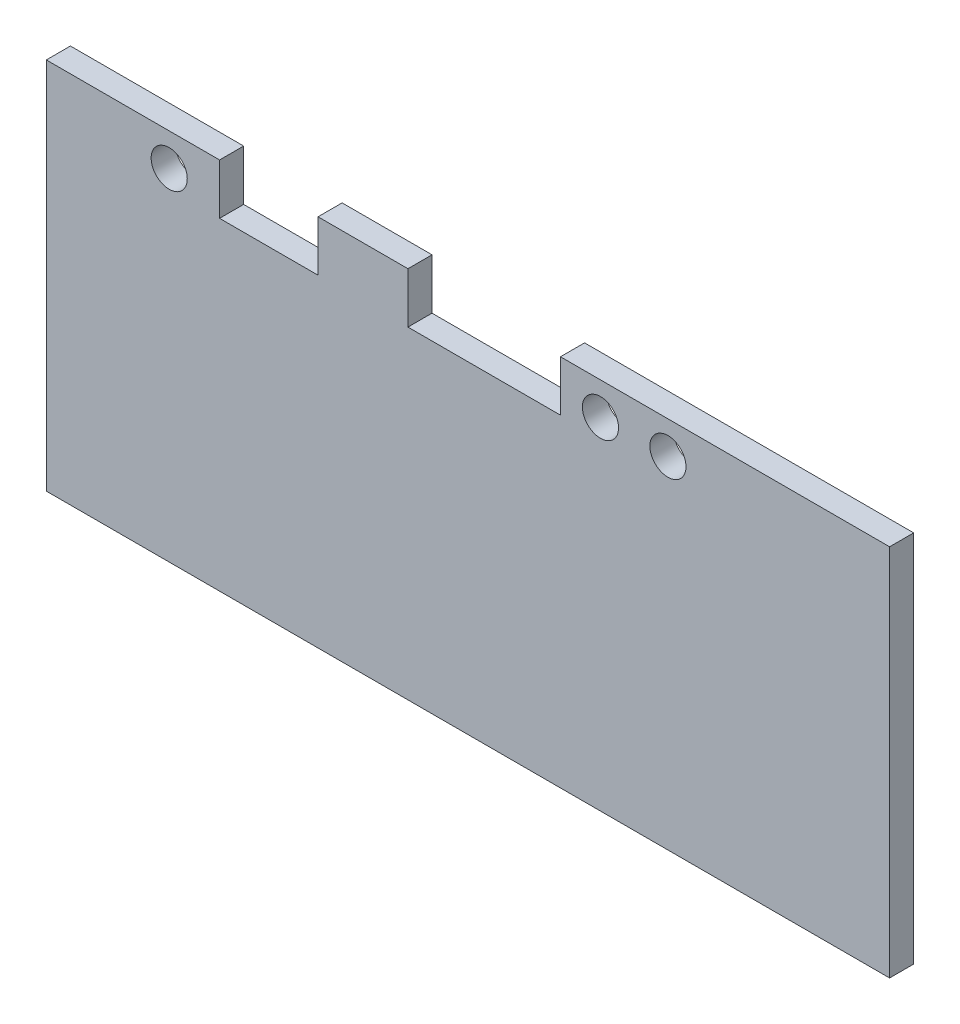
ISO-10303-21;
HEADER;
FILE_DESCRIPTION(('STEP AP214'),'2;1');
FILE_NAME('part.step','',(''),(''),'','','');
FILE_SCHEMA(('AUTOMOTIVE_DESIGN { 1 0 10303 214 1 1 1 1 }'));
ENDSEC;
DATA;
#1=APPLICATION_CONTEXT('core data for automotive mechanical design processes');
#2=APPLICATION_PROTOCOL_DEFINITION('international standard','automotive_design',2000,#1);
#3=PRODUCT_CONTEXT('',#1,'mechanical');
#4=PRODUCT('Part','Part','',(#3));
#5=PRODUCT_RELATED_PRODUCT_CATEGORY('part','',(#4));
#6=PRODUCT_DEFINITION_FORMATION('','',#4);
#7=PRODUCT_DEFINITION_CONTEXT('part definition',#1,'design');
#8=PRODUCT_DEFINITION('design','',#6,#7);
#9=PRODUCT_DEFINITION_SHAPE('','',#8);
#10=(LENGTH_UNIT() NAMED_UNIT(*) SI_UNIT(.MILLI.,.METRE.));
#11=(NAMED_UNIT(*) PLANE_ANGLE_UNIT() SI_UNIT($,.RADIAN.));
#12=(NAMED_UNIT(*) SI_UNIT($,.STERADIAN.) SOLID_ANGLE_UNIT());
#13=UNCERTAINTY_MEASURE_WITH_UNIT(LENGTH_MEASURE(1.E-05),#10,'distance_accuracy_value','');
#14=(GEOMETRIC_REPRESENTATION_CONTEXT(3) GLOBAL_UNCERTAINTY_ASSIGNED_CONTEXT((#13)) GLOBAL_UNIT_ASSIGNED_CONTEXT((#10,
#11,#12)) REPRESENTATION_CONTEXT('',''));
#15=CARTESIAN_POINT('',(0.,0.,0.));
#16=DIRECTION('',(0.,0.,1.));
#17=DIRECTION('',(1.,0.,0.));
#18=AXIS2_PLACEMENT_3D('',#15,#16,#17);
#19=CARTESIAN_POINT('',(0.,0.,1.));
#20=DIRECTION('',(0.,0.,1.));
#21=DIRECTION('',(1.,0.,0.));
#22=AXIS2_PLACEMENT_3D('',#19,#20,#21);
#23=PLANE('',#22);
#24=CARTESIAN_POINT('',(145.658,116.356,1.));
#25=DIRECTION('',(0.,0.,1.));
#26=DIRECTION('',(1.,0.,0.));
#27=AXIS2_PLACEMENT_3D('',#24,#25,#26);
#28=CIRCLE('',#27,0.750000000000043);
#29=CARTESIAN_POINT('',(146.408,116.356,1.));
#30=VERTEX_POINT('',#29);
#31=EDGE_CURVE('E148',#30,#30,#28,.T.);
#32=ORIENTED_EDGE('',*,*,#31,.F.);
#33=EDGE_LOOP('',(#32));
#34=FACE_BOUND('',#33,.T.);
#35=CARTESIAN_POINT('',(163.558,116.356,1.));
#36=DIRECTION('',(0.,0.,1.));
#37=DIRECTION('',(1.,0.,0.));
#38=AXIS2_PLACEMENT_3D('',#35,#36,#37);
#39=CIRCLE('',#38,0.750000000000043);
#40=CARTESIAN_POINT('',(164.308,116.356,1.));
#41=VERTEX_POINT('',#40);
#42=EDGE_CURVE('E171',#41,#41,#39,.T.);
#43=ORIENTED_EDGE('',*,*,#42,.F.);
#44=EDGE_LOOP('',(#43));
#45=FACE_BOUND('',#44,.T.);
#46=CARTESIAN_POINT('',(166.358,116.356,1.));
#47=DIRECTION('',(0.,0.,1.));
#48=DIRECTION('',(1.,0.,0.));
#49=AXIS2_PLACEMENT_3D('',#46,#47,#48);
#50=CIRCLE('',#49,0.749999999999955);
#51=CARTESIAN_POINT('',(167.108,116.356,1.));
#52=VERTEX_POINT('',#51);
#53=EDGE_CURVE('E168',#52,#52,#50,.T.);
#54=ORIENTED_EDGE('',*,*,#53,.F.);
#55=EDGE_LOOP('',(#54));
#56=FACE_BOUND('',#55,.T.);
#57=DIRECTION('',(1.,0.,0.));
#58=VECTOR('',#57,1.);
#59=CARTESIAN_POINT('',(0.,102.207,1.));
#60=LINE('',#59,#58);
#61=CARTESIAN_POINT('',(140.558,102.207,1.));
#62=VERTEX_POINT('',#61);
#63=CARTESIAN_POINT('',(141.514052701684,102.207268242066,1.));
#64=VERTEX_POINT('',#63);
#65=EDGE_CURVE('E11',#62,#64,#60,.T.);
#66=ORIENTED_EDGE('',*,*,#65,.T.);
#67=DIRECTION('',(0.999999992048205,0.000126109435827692,0.));
#68=VECTOR('',#67,1.);
#69=CARTESIAN_POINT('',(140.558,102.207,1.));
#70=LINE('',#69,#68);
#71=CARTESIAN_POINT('',(143.135937879696,102.207373895289,1.));
#72=VERTEX_POINT('',#71);
#73=EDGE_CURVE('E153',#64,#72,#70,.T.);
#74=ORIENTED_EDGE('',*,*,#73,.T.);
#75=DIRECTION('',(1.,0.,0.));
#76=VECTOR('',#75,1.);
#77=CARTESIAN_POINT('',(0.,102.207,1.));
#78=LINE('',#77,#76);
#79=CARTESIAN_POINT('',(175.558,102.207,1.));
#80=VERTEX_POINT('',#79);
#81=EDGE_CURVE('E58',#72,#80,#78,.T.);
#82=ORIENTED_EDGE('',*,*,#81,.T.);
#83=DIRECTION('',(0.,1.,0.));
#84=VECTOR('',#83,1.);
#85=CARTESIAN_POINT('',(175.558,0.,1.));
#86=LINE('',#85,#84);
#87=CARTESIAN_POINT('',(175.558,117.707,1.));
#88=VERTEX_POINT('',#87);
#89=EDGE_CURVE('E293',#80,#88,#86,.T.);
#90=ORIENTED_EDGE('',*,*,#89,.T.);
#91=DIRECTION('',(-1.,0.,0.));
#92=VECTOR('',#91,1.);
#93=CARTESIAN_POINT('',(0.,117.707,1.));
#94=LINE('',#93,#92);
#95=CARTESIAN_POINT('',(161.898,117.707,1.));
#96=VERTEX_POINT('',#95);
#97=EDGE_CURVE('E341',#88,#96,#94,.T.);
#98=ORIENTED_EDGE('',*,*,#97,.T.);
#99=DIRECTION('',(0.,-1.,0.));
#100=VECTOR('',#99,1.);
#101=CARTESIAN_POINT('',(161.898,0.,1.));
#102=LINE('',#101,#100);
#103=CARTESIAN_POINT('',(161.898,115.608,1.));
#104=VERTEX_POINT('',#103);
#105=EDGE_CURVE('E269',#96,#104,#102,.T.);
#106=ORIENTED_EDGE('',*,*,#105,.T.);
#107=DIRECTION('',(-1.,0.,0.));
#108=VECTOR('',#107,1.);
#109=CARTESIAN_POINT('',(0.,115.608,1.));
#110=LINE('',#109,#108);
#111=CARTESIAN_POINT('',(155.567,115.608,1.));
#112=VERTEX_POINT('',#111);
#113=EDGE_CURVE('E337',#104,#112,#110,.T.);
#114=ORIENTED_EDGE('',*,*,#113,.T.);
#115=DIRECTION('',(0.,1.,0.));
#116=VECTOR('',#115,1.);
#117=CARTESIAN_POINT('',(155.567,0.,1.));
#118=LINE('',#117,#116);
#119=CARTESIAN_POINT('',(155.567,117.707,1.));
#120=VERTEX_POINT('',#119);
#121=EDGE_CURVE('E334',#112,#120,#118,.T.);
#122=ORIENTED_EDGE('',*,*,#121,.T.);
#123=DIRECTION('',(-1.,0.,0.));
#124=VECTOR('',#123,1.);
#125=CARTESIAN_POINT('',(0.,117.707,1.));
#126=LINE('',#125,#124);
#127=CARTESIAN_POINT('',(151.835,117.707,1.));
#128=VERTEX_POINT('',#127);
#129=EDGE_CURVE('E331',#120,#128,#126,.T.);
#130=ORIENTED_EDGE('',*,*,#129,.T.);
#131=DIRECTION('',(0.,-1.,0.));
#132=VECTOR('',#131,1.);
#133=CARTESIAN_POINT('',(151.835,0.,1.));
#134=LINE('',#133,#132);
#135=CARTESIAN_POINT('',(151.835,115.608,1.));
#136=VERTEX_POINT('',#135);
#137=EDGE_CURVE('E328',#128,#136,#134,.T.);
#138=ORIENTED_EDGE('',*,*,#137,.T.);
#139=DIRECTION('',(-1.,0.,0.));
#140=VECTOR('',#139,1.);
#141=CARTESIAN_POINT('',(0.,115.608,1.));
#142=LINE('',#141,#140);
#143=CARTESIAN_POINT('',(147.749,115.608,1.));
#144=VERTEX_POINT('',#143);
#145=EDGE_CURVE('E325',#136,#144,#142,.T.);
#146=ORIENTED_EDGE('',*,*,#145,.T.);
#147=DIRECTION('',(0.,1.,0.));
#148=VECTOR('',#147,1.);
#149=CARTESIAN_POINT('',(147.749,0.,1.));
#150=LINE('',#149,#148);
#151=CARTESIAN_POINT('',(147.749,117.707,1.));
#152=VERTEX_POINT('',#151);
#153=EDGE_CURVE('E322',#144,#152,#150,.T.);
#154=ORIENTED_EDGE('',*,*,#153,.T.);
#155=DIRECTION('',(-1.,0.,0.));
#156=VECTOR('',#155,1.);
#157=CARTESIAN_POINT('',(0.,117.707,1.));
#158=LINE('',#157,#156);
#159=CARTESIAN_POINT('',(140.558,117.707,1.));
#160=VERTEX_POINT('',#159);
#161=EDGE_CURVE('E139',#152,#160,#158,.T.);
#162=ORIENTED_EDGE('',*,*,#161,.T.);
#163=DIRECTION('',(0.,-1.,0.));
#164=VECTOR('',#163,1.);
#165=CARTESIAN_POINT('',(140.558,0.,1.));
#166=LINE('',#165,#164);
#167=EDGE_CURVE('E137',#160,#62,#166,.T.);
#168=ORIENTED_EDGE('',*,*,#167,.T.);
#169=EDGE_LOOP('',(#66,#74,#82,#90,#98,#106,#114,#122,#130,#138,#146,#154,#162,#168));
#170=FACE_BOUND('',#169,.T.);
#171=ADVANCED_FACE('F39',(#34,#45,#56,#170),#23,.T.);
#172=CARTESIAN_POINT('',(0.,0.,0.));
#173=DIRECTION('',(0.,0.,1.));
#174=DIRECTION('',(1.,0.,0.));
#175=AXIS2_PLACEMENT_3D('',#172,#173,#174);
#176=PLANE('',#175);
#177=CARTESIAN_POINT('',(145.658,116.356,0.));
#178=DIRECTION('',(0.,0.,1.));
#179=DIRECTION('',(1.,0.,0.));
#180=AXIS2_PLACEMENT_3D('',#177,#178,#179);
#181=CIRCLE('',#180,0.750000000000043);
#182=CARTESIAN_POINT('',(146.408,116.356,0.));
#183=VERTEX_POINT('',#182);
#184=EDGE_CURVE('E43',#183,#183,#181,.T.);
#185=ORIENTED_EDGE('',*,*,#184,.T.);
#186=EDGE_LOOP('',(#185));
#187=FACE_BOUND('',#186,.T.);
#188=CARTESIAN_POINT('',(163.558,116.356,0.));
#189=DIRECTION('',(0.,0.,1.));
#190=DIRECTION('',(1.,0.,0.));
#191=AXIS2_PLACEMENT_3D('',#188,#189,#190);
#192=CIRCLE('',#191,0.750000000000043);
#193=CARTESIAN_POINT('',(164.308,116.356,0.));
#194=VERTEX_POINT('',#193);
#195=EDGE_CURVE('E147',#194,#194,#192,.T.);
#196=ORIENTED_EDGE('',*,*,#195,.T.);
#197=EDGE_LOOP('',(#196));
#198=FACE_BOUND('',#197,.T.);
#199=CARTESIAN_POINT('',(166.358,116.356,0.));
#200=DIRECTION('',(0.,0.,1.));
#201=DIRECTION('',(1.,0.,0.));
#202=AXIS2_PLACEMENT_3D('',#199,#200,#201);
#203=CIRCLE('',#202,0.749999999999955);
#204=CARTESIAN_POINT('',(167.108,116.356,0.));
#205=VERTEX_POINT('',#204);
#206=EDGE_CURVE('E145',#205,#205,#203,.T.);
#207=ORIENTED_EDGE('',*,*,#206,.T.);
#208=EDGE_LOOP('',(#207));
#209=FACE_BOUND('',#208,.T.);
#210=DIRECTION('',(1.,0.,0.));
#211=VECTOR('',#210,1.);
#212=CARTESIAN_POINT('',(0.,102.207,0.));
#213=LINE('',#212,#211);
#214=CARTESIAN_POINT('',(143.135937879696,102.207373895289,0.));
#215=VERTEX_POINT('',#214);
#216=CARTESIAN_POINT('',(175.558,102.207,0.));
#217=VERTEX_POINT('',#216);
#218=EDGE_CURVE('E125',#215,#217,#213,.T.);
#219=ORIENTED_EDGE('',*,*,#218,.F.);
#220=DIRECTION('',(0.999999992048205,0.000126109435827692,0.));
#221=VECTOR('',#220,1.);
#222=CARTESIAN_POINT('',(140.558,102.207,0.));
#223=LINE('',#222,#221);
#224=CARTESIAN_POINT('',(141.514052701684,102.207268242066,0.));
#225=VERTEX_POINT('',#224);
#226=EDGE_CURVE('E110',#225,#215,#223,.T.);
#227=ORIENTED_EDGE('',*,*,#226,.F.);
#228=DIRECTION('',(1.,0.,0.));
#229=VECTOR('',#228,1.);
#230=CARTESIAN_POINT('',(0.,102.207,0.));
#231=LINE('',#230,#229);
#232=CARTESIAN_POINT('',(140.558,102.207,0.));
#233=VERTEX_POINT('',#232);
#234=EDGE_CURVE('E49',#233,#225,#231,.T.);
#235=ORIENTED_EDGE('',*,*,#234,.F.);
#236=DIRECTION('',(0.,-1.,0.));
#237=VECTOR('',#236,1.);
#238=CARTESIAN_POINT('',(140.558,0.,0.));
#239=LINE('',#238,#237);
#240=CARTESIAN_POINT('',(140.558,117.707,0.));
#241=VERTEX_POINT('',#240);
#242=EDGE_CURVE('E107',#241,#233,#239,.T.);
#243=ORIENTED_EDGE('',*,*,#242,.F.);
#244=DIRECTION('',(-1.,0.,0.));
#245=VECTOR('',#244,1.);
#246=CARTESIAN_POINT('',(0.,117.707,0.));
#247=LINE('',#246,#245);
#248=CARTESIAN_POINT('',(147.749,117.707,0.));
#249=VERTEX_POINT('',#248);
#250=EDGE_CURVE('E126',#249,#241,#247,.T.);
#251=ORIENTED_EDGE('',*,*,#250,.F.);
#252=DIRECTION('',(0.,1.,0.));
#253=VECTOR('',#252,1.);
#254=CARTESIAN_POINT('',(147.749,0.,0.));
#255=LINE('',#254,#253);
#256=CARTESIAN_POINT('',(147.749,115.608,0.));
#257=VERTEX_POINT('',#256);
#258=EDGE_CURVE('E287',#257,#249,#255,.T.);
#259=ORIENTED_EDGE('',*,*,#258,.F.);
#260=DIRECTION('',(-1.,0.,0.));
#261=VECTOR('',#260,1.);
#262=CARTESIAN_POINT('',(0.,115.608,0.));
#263=LINE('',#262,#261);
#264=CARTESIAN_POINT('',(151.835,115.608,0.));
#265=VERTEX_POINT('',#264);
#266=EDGE_CURVE('E285',#265,#257,#263,.T.);
#267=ORIENTED_EDGE('',*,*,#266,.F.);
#268=DIRECTION('',(0.,-1.,0.));
#269=VECTOR('',#268,1.);
#270=CARTESIAN_POINT('',(151.835,0.,0.));
#271=LINE('',#270,#269);
#272=CARTESIAN_POINT('',(151.835,117.707,0.));
#273=VERTEX_POINT('',#272);
#274=EDGE_CURVE('E283',#273,#265,#271,.T.);
#275=ORIENTED_EDGE('',*,*,#274,.F.);
#276=DIRECTION('',(-1.,0.,0.));
#277=VECTOR('',#276,1.);
#278=CARTESIAN_POINT('',(0.,117.707,0.));
#279=LINE('',#278,#277);
#280=CARTESIAN_POINT('',(155.567,117.707,0.));
#281=VERTEX_POINT('',#280);
#282=EDGE_CURVE('E281',#281,#273,#279,.T.);
#283=ORIENTED_EDGE('',*,*,#282,.F.);
#284=DIRECTION('',(0.,1.,0.));
#285=VECTOR('',#284,1.);
#286=CARTESIAN_POINT('',(155.567,0.,0.));
#287=LINE('',#286,#285);
#288=CARTESIAN_POINT('',(155.567,115.608,0.));
#289=VERTEX_POINT('',#288);
#290=EDGE_CURVE('E276',#289,#281,#287,.T.);
#291=ORIENTED_EDGE('',*,*,#290,.F.);
#292=DIRECTION('',(-1.,0.,0.));
#293=VECTOR('',#292,1.);
#294=CARTESIAN_POINT('',(0.,115.608,0.));
#295=LINE('',#294,#293);
#296=CARTESIAN_POINT('',(161.898,115.608,0.));
#297=VERTEX_POINT('',#296);
#298=EDGE_CURVE('E274',#297,#289,#295,.T.);
#299=ORIENTED_EDGE('',*,*,#298,.F.);
#300=DIRECTION('',(0.,-1.,0.));
#301=VECTOR('',#300,1.);
#302=CARTESIAN_POINT('',(161.898,0.,0.));
#303=LINE('',#302,#301);
#304=CARTESIAN_POINT('',(161.898,117.707,0.));
#305=VERTEX_POINT('',#304);
#306=EDGE_CURVE('E264',#305,#297,#303,.T.);
#307=ORIENTED_EDGE('',*,*,#306,.F.);
#308=DIRECTION('',(-1.,0.,0.));
#309=VECTOR('',#308,1.);
#310=CARTESIAN_POINT('',(0.,117.707,0.));
#311=LINE('',#310,#309);
#312=CARTESIAN_POINT('',(175.558,117.707,0.));
#313=VERTEX_POINT('',#312);
#314=EDGE_CURVE('E254',#313,#305,#311,.T.);
#315=ORIENTED_EDGE('',*,*,#314,.F.);
#316=DIRECTION('',(0.,1.,0.));
#317=VECTOR('',#316,1.);
#318=CARTESIAN_POINT('',(175.558,0.,0.));
#319=LINE('',#318,#317);
#320=EDGE_CURVE('E159',#217,#313,#319,.T.);
#321=ORIENTED_EDGE('',*,*,#320,.F.);
#322=EDGE_LOOP('',(#219,#227,#235,#243,#251,#259,#267,#275,#283,#291,#299,#307,#315,#321));
#323=FACE_BOUND('',#322,.T.);
#324=ADVANCED_FACE('F105',(#187,#198,#209,#323),#176,.F.);
#325=CARTESIAN_POINT('',(175.558,0.,1.));
#326=DIRECTION('',(-1.,0.,0.));
#327=DIRECTION('',(0.,0.,1.));
#328=AXIS2_PLACEMENT_3D('',#325,#326,#327);
#329=PLANE('',#328);
#330=ORIENTED_EDGE('',*,*,#320,.T.);
#331=DIRECTION('',(0.,0.,-1.));
#332=VECTOR('',#331,1.);
#333=CARTESIAN_POINT('',(175.558,117.707,1.));
#334=LINE('',#333,#332);
#335=EDGE_CURVE('E114',#88,#313,#334,.T.);
#336=ORIENTED_EDGE('',*,*,#335,.F.);
#337=ORIENTED_EDGE('',*,*,#89,.F.);
#338=DIRECTION('',(0.,0.,-1.));
#339=VECTOR('',#338,1.);
#340=CARTESIAN_POINT('',(175.558,102.207,1.));
#341=LINE('',#340,#339);
#342=EDGE_CURVE('E294',#80,#217,#341,.T.);
#343=ORIENTED_EDGE('',*,*,#342,.T.);
#344=EDGE_LOOP('',(#330,#336,#337,#343));
#345=FACE_BOUND('',#344,.T.);
#346=ADVANCED_FACE('F41',(#345),#329,.F.);
#347=CARTESIAN_POINT('',(0.,117.707,1.));
#348=DIRECTION('',(0.,-1.,0.));
#349=DIRECTION('',(0.,0.,-1.));
#350=AXIS2_PLACEMENT_3D('',#347,#348,#349);
#351=PLANE('',#350);
#352=ORIENTED_EDGE('',*,*,#314,.T.);
#353=DIRECTION('',(0.,0.,-1.));
#354=VECTOR('',#353,1.);
#355=CARTESIAN_POINT('',(161.898,117.707,1.));
#356=LINE('',#355,#354);
#357=EDGE_CURVE('E258',#96,#305,#356,.T.);
#358=ORIENTED_EDGE('',*,*,#357,.F.);
#359=ORIENTED_EDGE('',*,*,#97,.F.);
#360=ORIENTED_EDGE('',*,*,#335,.T.);
#361=EDGE_LOOP('',(#352,#358,#359,#360));
#362=FACE_BOUND('',#361,.T.);
#363=ADVANCED_FACE('F244',(#362),#351,.F.);
#364=CARTESIAN_POINT('',(161.898,0.,1.));
#365=DIRECTION('',(1.,0.,0.));
#366=DIRECTION('',(0.,0.,-1.));
#367=AXIS2_PLACEMENT_3D('',#364,#365,#366);
#368=PLANE('',#367);
#369=ORIENTED_EDGE('',*,*,#306,.T.);
#370=DIRECTION('',(0.,0.,-1.));
#371=VECTOR('',#370,1.);
#372=CARTESIAN_POINT('',(161.898,115.608,1.));
#373=LINE('',#372,#371);
#374=EDGE_CURVE('E270',#104,#297,#373,.T.);
#375=ORIENTED_EDGE('',*,*,#374,.F.);
#376=ORIENTED_EDGE('',*,*,#105,.F.);
#377=ORIENTED_EDGE('',*,*,#357,.T.);
#378=EDGE_LOOP('',(#369,#375,#376,#377));
#379=FACE_BOUND('',#378,.T.);
#380=ADVANCED_FACE('F241',(#379),#368,.F.);
#381=CARTESIAN_POINT('',(0.,115.608,1.));
#382=DIRECTION('',(0.,-1.,0.));
#383=DIRECTION('',(0.,0.,-1.));
#384=AXIS2_PLACEMENT_3D('',#381,#382,#383);
#385=PLANE('',#384);
#386=ORIENTED_EDGE('',*,*,#298,.T.);
#387=DIRECTION('',(0.,0.,-1.));
#388=VECTOR('',#387,1.);
#389=CARTESIAN_POINT('',(155.567,115.608,1.));
#390=LINE('',#389,#388);
#391=EDGE_CURVE('E311',#112,#289,#390,.T.);
#392=ORIENTED_EDGE('',*,*,#391,.F.);
#393=ORIENTED_EDGE('',*,*,#113,.F.);
#394=ORIENTED_EDGE('',*,*,#374,.T.);
#395=EDGE_LOOP('',(#386,#392,#393,#394));
#396=FACE_BOUND('',#395,.T.);
#397=ADVANCED_FACE('F237',(#396),#385,.F.);
#398=CARTESIAN_POINT('',(155.567,0.,1.));
#399=DIRECTION('',(-1.,0.,0.));
#400=DIRECTION('',(0.,0.,1.));
#401=AXIS2_PLACEMENT_3D('',#398,#399,#400);
#402=PLANE('',#401);
#403=ORIENTED_EDGE('',*,*,#290,.T.);
#404=DIRECTION('',(0.,0.,-1.));
#405=VECTOR('',#404,1.);
#406=CARTESIAN_POINT('',(155.567,117.707,1.));
#407=LINE('',#406,#405);
#408=EDGE_CURVE('E308',#120,#281,#407,.T.);
#409=ORIENTED_EDGE('',*,*,#408,.F.);
#410=ORIENTED_EDGE('',*,*,#121,.F.);
#411=ORIENTED_EDGE('',*,*,#391,.T.);
#412=EDGE_LOOP('',(#403,#409,#410,#411));
#413=FACE_BOUND('',#412,.T.);
#414=ADVANCED_FACE('F233',(#413),#402,.F.);
#415=CARTESIAN_POINT('',(0.,117.707,1.));
#416=DIRECTION('',(0.,-1.,0.));
#417=DIRECTION('',(0.,0.,-1.));
#418=AXIS2_PLACEMENT_3D('',#415,#416,#417);
#419=PLANE('',#418);
#420=ORIENTED_EDGE('',*,*,#282,.T.);
#421=DIRECTION('',(0.,0.,-1.));
#422=VECTOR('',#421,1.);
#423=CARTESIAN_POINT('',(151.835,117.707,1.));
#424=LINE('',#423,#422);
#425=EDGE_CURVE('E305',#128,#273,#424,.T.);
#426=ORIENTED_EDGE('',*,*,#425,.F.);
#427=ORIENTED_EDGE('',*,*,#129,.F.);
#428=ORIENTED_EDGE('',*,*,#408,.T.);
#429=EDGE_LOOP('',(#420,#426,#427,#428));
#430=FACE_BOUND('',#429,.T.);
#431=ADVANCED_FACE('F229',(#430),#419,.F.);
#432=CARTESIAN_POINT('',(151.835,0.,1.));
#433=DIRECTION('',(1.,0.,0.));
#434=DIRECTION('',(0.,0.,-1.));
#435=AXIS2_PLACEMENT_3D('',#432,#433,#434);
#436=PLANE('',#435);
#437=ORIENTED_EDGE('',*,*,#274,.T.);
#438=DIRECTION('',(0.,0.,-1.));
#439=VECTOR('',#438,1.);
#440=CARTESIAN_POINT('',(151.835,115.608,1.));
#441=LINE('',#440,#439);
#442=EDGE_CURVE('E302',#136,#265,#441,.T.);
#443=ORIENTED_EDGE('',*,*,#442,.F.);
#444=ORIENTED_EDGE('',*,*,#137,.F.);
#445=ORIENTED_EDGE('',*,*,#425,.T.);
#446=EDGE_LOOP('',(#437,#443,#444,#445));
#447=FACE_BOUND('',#446,.T.);
#448=ADVANCED_FACE('F225',(#447),#436,.F.);
#449=CARTESIAN_POINT('',(0.,115.608,1.));
#450=DIRECTION('',(0.,-1.,0.));
#451=DIRECTION('',(0.,0.,-1.));
#452=AXIS2_PLACEMENT_3D('',#449,#450,#451);
#453=PLANE('',#452);
#454=ORIENTED_EDGE('',*,*,#266,.T.);
#455=DIRECTION('',(0.,0.,-1.));
#456=VECTOR('',#455,1.);
#457=CARTESIAN_POINT('',(147.749,115.608,1.));
#458=LINE('',#457,#456);
#459=EDGE_CURVE('E299',#144,#257,#458,.T.);
#460=ORIENTED_EDGE('',*,*,#459,.F.);
#461=ORIENTED_EDGE('',*,*,#145,.F.);
#462=ORIENTED_EDGE('',*,*,#442,.T.);
#463=EDGE_LOOP('',(#454,#460,#461,#462));
#464=FACE_BOUND('',#463,.T.);
#465=ADVANCED_FACE('F221',(#464),#453,.F.);
#466=CARTESIAN_POINT('',(147.749,0.,1.));
#467=DIRECTION('',(-1.,0.,0.));
#468=DIRECTION('',(0.,0.,1.));
#469=AXIS2_PLACEMENT_3D('',#466,#467,#468);
#470=PLANE('',#469);
#471=ORIENTED_EDGE('',*,*,#258,.T.);
#472=DIRECTION('',(0.,0.,-1.));
#473=VECTOR('',#472,1.);
#474=CARTESIAN_POINT('',(147.749,117.707,1.));
#475=LINE('',#474,#473);
#476=EDGE_CURVE('E131',#152,#249,#475,.T.);
#477=ORIENTED_EDGE('',*,*,#476,.F.);
#478=ORIENTED_EDGE('',*,*,#153,.F.);
#479=ORIENTED_EDGE('',*,*,#459,.T.);
#480=EDGE_LOOP('',(#471,#477,#478,#479));
#481=FACE_BOUND('',#480,.T.);
#482=ADVANCED_FACE('F217',(#481),#470,.F.);
#483=CARTESIAN_POINT('',(0.,117.707,1.));
#484=DIRECTION('',(0.,-1.,0.));
#485=DIRECTION('',(0.,0.,-1.));
#486=AXIS2_PLACEMENT_3D('',#483,#484,#485);
#487=PLANE('',#486);
#488=ORIENTED_EDGE('',*,*,#250,.T.);
#489=DIRECTION('',(0.,0.,-1.));
#490=VECTOR('',#489,1.);
#491=CARTESIAN_POINT('',(140.558,117.707,1.));
#492=LINE('',#491,#490);
#493=EDGE_CURVE('E124',#160,#241,#492,.T.);
#494=ORIENTED_EDGE('',*,*,#493,.F.);
#495=ORIENTED_EDGE('',*,*,#161,.F.);
#496=ORIENTED_EDGE('',*,*,#476,.T.);
#497=EDGE_LOOP('',(#488,#494,#495,#496));
#498=FACE_BOUND('',#497,.T.);
#499=ADVANCED_FACE('F214',(#498),#487,.F.);
#500=CARTESIAN_POINT('',(140.558,0.,1.));
#501=DIRECTION('',(1.,0.,0.));
#502=DIRECTION('',(0.,0.,-1.));
#503=AXIS2_PLACEMENT_3D('',#500,#501,#502);
#504=PLANE('',#503);
#505=ORIENTED_EDGE('',*,*,#242,.T.);
#506=DIRECTION('',(0.,0.,-1.));
#507=VECTOR('',#506,1.);
#508=CARTESIAN_POINT('',(140.558,102.207,1.));
#509=LINE('',#508,#507);
#510=EDGE_CURVE('E121',#62,#233,#509,.T.);
#511=ORIENTED_EDGE('',*,*,#510,.F.);
#512=ORIENTED_EDGE('',*,*,#167,.F.);
#513=ORIENTED_EDGE('',*,*,#493,.T.);
#514=EDGE_LOOP('',(#505,#511,#512,#513));
#515=FACE_BOUND('',#514,.T.);
#516=ADVANCED_FACE('F119',(#515),#504,.F.);
#517=CARTESIAN_POINT('',(0.,102.207,1.));
#518=DIRECTION('',(0.,1.,0.));
#519=DIRECTION('',(0.,0.,1.));
#520=AXIS2_PLACEMENT_3D('',#517,#518,#519);
#521=PLANE('',#520);
#522=ORIENTED_EDGE('',*,*,#234,.T.);
#523=CARTESIAN_POINT('',(141.514172515999,102.207120582377,1.));
#524=DIRECTION('',(0.,0.,-1.));
#525=VECTOR('',#524,1.);
#526=LINE('',#523,#525);
#527=EDGE_CURVE('E129',#64,#225,#526,.T.);
#528=ORIENTED_EDGE('',*,*,#527,.F.);
#529=ORIENTED_EDGE('',*,*,#65,.F.);
#530=ORIENTED_EDGE('',*,*,#510,.T.);
#531=EDGE_LOOP('',(#522,#528,#529,#530));
#532=FACE_BOUND('',#531,.T.);
#533=ADVANCED_FACE('F128',(#532),#521,.F.);
#534=ORIENTED_EDGE('',*,*,#218,.T.);
#535=ORIENTED_EDGE('',*,*,#342,.F.);
#536=ORIENTED_EDGE('',*,*,#81,.F.);
#537=CARTESIAN_POINT('',(143.136,102.207,1.));
#538=DIRECTION('',(0.,0.,-1.));
#539=VECTOR('',#538,1.);
#540=LINE('',#537,#539);
#541=EDGE_CURVE('E134',#72,#215,#540,.T.);
#542=ORIENTED_EDGE('',*,*,#541,.T.);
#543=EDGE_LOOP('',(#534,#535,#536,#542));
#544=FACE_BOUND('',#543,.T.);
#545=ADVANCED_FACE('F199',(#544),#521,.F.);
#546=CARTESIAN_POINT('',(140.558,102.207,0.));
#547=DIRECTION('',(0.000126109435827692,-0.999999992048205,0.));
#548=DIRECTION('',(0.999999992048205,0.000126109435827692,0.));
#549=AXIS2_PLACEMENT_3D('',#546,#547,#548);
#550=PLANE('',#549);
#551=ORIENTED_EDGE('',*,*,#541,.F.);
#552=ORIENTED_EDGE('',*,*,#73,.F.);
#553=ORIENTED_EDGE('',*,*,#527,.T.);
#554=ORIENTED_EDGE('',*,*,#226,.T.);
#555=EDGE_LOOP('',(#551,#552,#553,#554));
#556=FACE_BOUND('',#555,.T.);
#557=ADVANCED_FACE('F209',(#556),#550,.T.);
#558=CARTESIAN_POINT('',(166.358,116.356,-0.00682397403952198));
#559=DIRECTION('',(0.,0.,1.));
#560=DIRECTION('',(1.,0.,0.));
#561=AXIS2_PLACEMENT_3D('',#558,#559,#560);
#562=CYLINDRICAL_SURFACE('',#561,0.749999999999955);
#563=ORIENTED_EDGE('',*,*,#53,.T.);
#564=EDGE_LOOP('',(#563));
#565=FACE_BOUND('',#564,.T.);
#566=ORIENTED_EDGE('',*,*,#206,.F.);
#567=EDGE_LOOP('',(#566));
#568=FACE_BOUND('',#567,.T.);
#569=ADVANCED_FACE('F356',(#565,#568),#562,.F.);
#570=CARTESIAN_POINT('',(163.558,116.356,-0.00682397403952198));
#571=DIRECTION('',(0.,0.,1.));
#572=DIRECTION('',(1.,0.,0.));
#573=AXIS2_PLACEMENT_3D('',#570,#571,#572);
#574=CYLINDRICAL_SURFACE('',#573,0.750000000000043);
#575=ORIENTED_EDGE('',*,*,#42,.T.);
#576=EDGE_LOOP('',(#575));
#577=FACE_BOUND('',#576,.T.);
#578=ORIENTED_EDGE('',*,*,#195,.F.);
#579=EDGE_LOOP('',(#578));
#580=FACE_BOUND('',#579,.T.);
#581=ADVANCED_FACE('F367',(#577,#580),#574,.F.);
#582=CARTESIAN_POINT('',(145.658,116.356,-0.00682397403952198));
#583=DIRECTION('',(0.,0.,1.));
#584=DIRECTION('',(1.,0.,0.));
#585=AXIS2_PLACEMENT_3D('',#582,#583,#584);
#586=CYLINDRICAL_SURFACE('',#585,0.750000000000043);
#587=ORIENTED_EDGE('',*,*,#31,.T.);
#588=EDGE_LOOP('',(#587));
#589=FACE_BOUND('',#588,.T.);
#590=ORIENTED_EDGE('',*,*,#184,.F.);
#591=EDGE_LOOP('',(#590));
#592=FACE_BOUND('',#591,.T.);
#593=ADVANCED_FACE('F177',(#589,#592),#586,.F.);
#594=CLOSED_SHELL('',(#171,#324,#346,#363,#380,#397,#414,#431,#448,#465,#482,#499,#516,#533,
#545,#557,#569,#581,#593));
#595=MANIFOLD_SOLID_BREP('B2',#594);
#596=ADVANCED_BREP_SHAPE_REPRESENTATION('',(#18,#595),#14);
#597=SHAPE_DEFINITION_REPRESENTATION(#9,#596);
ENDSEC;
END-ISO-10303-21;
